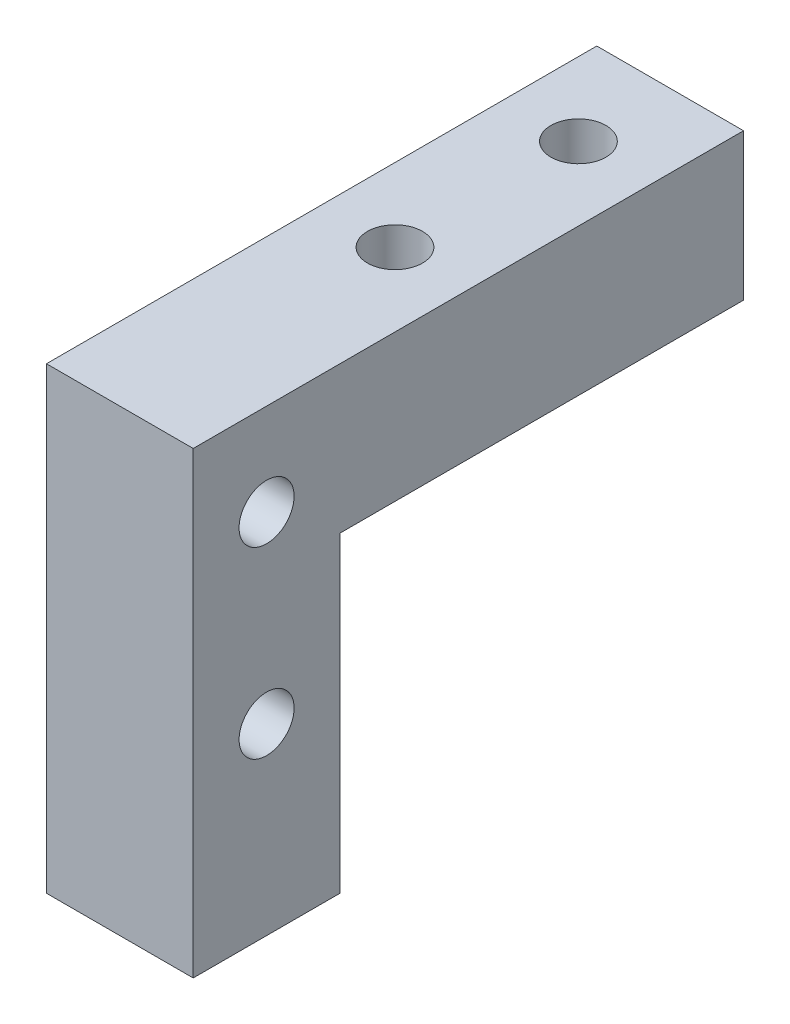
ISO-10303-21;
HEADER;
FILE_DESCRIPTION(('STEP AP214'),'2;1');
FILE_NAME('part.step','',(''),(''),'','','');
FILE_SCHEMA(('AUTOMOTIVE_DESIGN { 1 0 10303 214 1 1 1 1 }'));
ENDSEC;
DATA;
#1=APPLICATION_CONTEXT('core data for automotive mechanical design processes');
#2=APPLICATION_PROTOCOL_DEFINITION('international standard','automotive_design',2000,#1);
#3=PRODUCT_CONTEXT('',#1,'mechanical');
#4=PRODUCT('Part','Part','',(#3));
#5=PRODUCT_RELATED_PRODUCT_CATEGORY('part','',(#4));
#6=PRODUCT_DEFINITION_FORMATION('','',#4);
#7=PRODUCT_DEFINITION_CONTEXT('part definition',#1,'design');
#8=PRODUCT_DEFINITION('design','',#6,#7);
#9=PRODUCT_DEFINITION_SHAPE('','',#8);
#10=(LENGTH_UNIT() NAMED_UNIT(*) SI_UNIT(.MILLI.,.METRE.));
#11=(NAMED_UNIT(*) PLANE_ANGLE_UNIT() SI_UNIT($,.RADIAN.));
#12=(NAMED_UNIT(*) SI_UNIT($,.STERADIAN.) SOLID_ANGLE_UNIT());
#13=UNCERTAINTY_MEASURE_WITH_UNIT(LENGTH_MEASURE(1.E-05),#10,'distance_accuracy_value','');
#14=(GEOMETRIC_REPRESENTATION_CONTEXT(3) GLOBAL_UNCERTAINTY_ASSIGNED_CONTEXT((#13)) GLOBAL_UNIT_ASSIGNED_CONTEXT((#10,
#11,#12)) REPRESENTATION_CONTEXT('',''));
#15=CARTESIAN_POINT('',(0.,0.,0.));
#16=DIRECTION('',(0.,0.,1.));
#17=DIRECTION('',(1.,0.,0.));
#18=AXIS2_PLACEMENT_3D('',#15,#16,#17);
#19=CARTESIAN_POINT('',(8.,0.,-44.));
#20=DIRECTION('',(0.,1.,0.));
#21=DIRECTION('',(0.,0.,1.));
#22=AXIS2_PLACEMENT_3D('',#19,#20,#21);
#23=PLANE('',#22);
#24=CARTESIAN_POINT('',(0.,0.,-14.));
#25=DIRECTION('',(0.,1.,0.));
#26=DIRECTION('',(0.,0.,1.));
#27=AXIS2_PLACEMENT_3D('',#24,#25,#26);
#28=CIRCLE('',#27,3.);
#29=CARTESIAN_POINT('',(0.,0.,-11.));
#30=VERTEX_POINT('',#29);
#31=EDGE_CURVE('E168',#30,#30,#28,.T.);
#32=ORIENTED_EDGE('',*,*,#31,.T.);
#33=EDGE_LOOP('',(#32));
#34=FACE_BOUND('',#33,.T.);
#35=CARTESIAN_POINT('',(0.,0.,-34.));
#36=DIRECTION('',(0.,1.,0.));
#37=DIRECTION('',(0.,0.,1.));
#38=AXIS2_PLACEMENT_3D('',#35,#36,#37);
#39=CIRCLE('',#38,3.);
#40=CARTESIAN_POINT('',(0.,0.,-31.));
#41=VERTEX_POINT('',#40);
#42=EDGE_CURVE('E171',#41,#41,#39,.T.);
#43=ORIENTED_EDGE('',*,*,#42,.T.);
#44=EDGE_LOOP('',(#43));
#45=FACE_BOUND('',#44,.T.);
#46=DIRECTION('',(0.,0.,-1.));
#47=VECTOR('',#46,1.);
#48=CARTESIAN_POINT('',(-8.,0.,-44.));
#49=LINE('',#48,#47);
#50=CARTESIAN_POINT('',(-8.,0.,0.));
#51=VERTEX_POINT('',#50);
#52=CARTESIAN_POINT('',(-8.,0.,-44.));
#53=VERTEX_POINT('',#52);
#54=EDGE_CURVE('E121',#51,#53,#49,.T.);
#55=ORIENTED_EDGE('',*,*,#54,.T.);
#56=DIRECTION('',(-1.,0.,0.));
#57=VECTOR('',#56,1.);
#58=CARTESIAN_POINT('',(8.,0.,-44.));
#59=LINE('',#58,#57);
#60=CARTESIAN_POINT('',(8.,0.,-44.));
#61=VERTEX_POINT('',#60);
#62=EDGE_CURVE('E11',#61,#53,#59,.T.);
#63=ORIENTED_EDGE('',*,*,#62,.F.);
#64=DIRECTION('',(0.,0.,-1.));
#65=VECTOR('',#64,1.);
#66=CARTESIAN_POINT('',(8.,0.,-44.));
#67=LINE('',#66,#65);
#68=CARTESIAN_POINT('',(8.,0.,0.));
#69=VERTEX_POINT('',#68);
#70=EDGE_CURVE('E132',#69,#61,#67,.T.);
#71=ORIENTED_EDGE('',*,*,#70,.F.);
#72=DIRECTION('',(-1.,0.,0.));
#73=VECTOR('',#72,1.);
#74=CARTESIAN_POINT('',(8.,0.,0.));
#75=LINE('',#74,#73);
#76=EDGE_CURVE('E117',#69,#51,#75,.T.);
#77=ORIENTED_EDGE('',*,*,#76,.T.);
#78=EDGE_LOOP('',(#55,#63,#71,#77));
#79=FACE_BOUND('',#78,.T.);
#80=ADVANCED_FACE('F37',(#34,#45,#79),#23,.F.);
#81=CARTESIAN_POINT('',(8.,16.,-44.));
#82=DIRECTION('',(0.,0.,1.));
#83=DIRECTION('',(1.,0.,0.));
#84=AXIS2_PLACEMENT_3D('',#81,#82,#83);
#85=PLANE('',#84);
#86=DIRECTION('',(0.,1.,0.));
#87=VECTOR('',#86,1.);
#88=CARTESIAN_POINT('',(-8.,16.,-44.));
#89=LINE('',#88,#87);
#90=CARTESIAN_POINT('',(-8.,16.,-44.));
#91=VERTEX_POINT('',#90);
#92=EDGE_CURVE('E124',#53,#91,#89,.T.);
#93=ORIENTED_EDGE('',*,*,#92,.T.);
#94=DIRECTION('',(-1.,0.,0.));
#95=VECTOR('',#94,1.);
#96=CARTESIAN_POINT('',(8.,16.,-44.));
#97=LINE('',#96,#95);
#98=CARTESIAN_POINT('',(8.,16.,-44.));
#99=VERTEX_POINT('',#98);
#100=EDGE_CURVE('E45',#99,#91,#97,.T.);
#101=ORIENTED_EDGE('',*,*,#100,.F.);
#102=DIRECTION('',(0.,1.,0.));
#103=VECTOR('',#102,1.);
#104=CARTESIAN_POINT('',(8.,16.,-44.));
#105=LINE('',#104,#103);
#106=EDGE_CURVE('E90',#61,#99,#105,.T.);
#107=ORIENTED_EDGE('',*,*,#106,.F.);
#108=ORIENTED_EDGE('',*,*,#62,.T.);
#109=EDGE_LOOP('',(#93,#101,#107,#108));
#110=FACE_BOUND('',#109,.T.);
#111=ADVANCED_FACE('F158',(#110),#85,.F.);
#112=CARTESIAN_POINT('',(8.,16.,16.));
#113=DIRECTION('',(0.,-1.,0.));
#114=DIRECTION('',(0.,0.,-1.));
#115=AXIS2_PLACEMENT_3D('',#112,#113,#114);
#116=PLANE('',#115);
#117=CARTESIAN_POINT('',(0.,16.,-14.));
#118=DIRECTION('',(0.,1.,0.));
#119=DIRECTION('',(0.,0.,1.));
#120=AXIS2_PLACEMENT_3D('',#117,#118,#119);
#121=CIRCLE('',#120,3.);
#122=CARTESIAN_POINT('',(0.,16.,-11.));
#123=VERTEX_POINT('',#122);
#124=EDGE_CURVE('E221',#123,#123,#121,.T.);
#125=ORIENTED_EDGE('',*,*,#124,.F.);
#126=EDGE_LOOP('',(#125));
#127=FACE_BOUND('',#126,.T.);
#128=CARTESIAN_POINT('',(0.,16.,-34.));
#129=DIRECTION('',(0.,1.,0.));
#130=DIRECTION('',(0.,0.,1.));
#131=AXIS2_PLACEMENT_3D('',#128,#129,#130);
#132=CIRCLE('',#131,3.);
#133=CARTESIAN_POINT('',(0.,16.,-31.));
#134=VERTEX_POINT('',#133);
#135=EDGE_CURVE('E174',#134,#134,#132,.T.);
#136=ORIENTED_EDGE('',*,*,#135,.F.);
#137=EDGE_LOOP('',(#136));
#138=FACE_BOUND('',#137,.T.);
#139=DIRECTION('',(0.,0.,1.));
#140=VECTOR('',#139,1.);
#141=CARTESIAN_POINT('',(-8.,16.,16.));
#142=LINE('',#141,#140);
#143=CARTESIAN_POINT('',(-8.,16.,16.));
#144=VERTEX_POINT('',#143);
#145=EDGE_CURVE('E127',#91,#144,#142,.T.);
#146=ORIENTED_EDGE('',*,*,#145,.T.);
#147=DIRECTION('',(-1.,0.,0.));
#148=VECTOR('',#147,1.);
#149=CARTESIAN_POINT('',(8.,16.,16.));
#150=LINE('',#149,#148);
#151=CARTESIAN_POINT('',(8.,16.,16.));
#152=VERTEX_POINT('',#151);
#153=EDGE_CURVE('E112',#152,#144,#150,.T.);
#154=ORIENTED_EDGE('',*,*,#153,.F.);
#155=DIRECTION('',(0.,0.,1.));
#156=VECTOR('',#155,1.);
#157=CARTESIAN_POINT('',(8.,16.,16.));
#158=LINE('',#157,#156);
#159=EDGE_CURVE('E103',#99,#152,#158,.T.);
#160=ORIENTED_EDGE('',*,*,#159,.F.);
#161=ORIENTED_EDGE('',*,*,#100,.T.);
#162=EDGE_LOOP('',(#146,#154,#160,#161));
#163=FACE_BOUND('',#162,.T.);
#164=ADVANCED_FACE('F138',(#127,#138,#163),#116,.F.);
#165=CARTESIAN_POINT('',(8.,-34.,16.));
#166=DIRECTION('',(0.,0.,-1.));
#167=DIRECTION('',(-1.,0.,0.));
#168=AXIS2_PLACEMENT_3D('',#165,#166,#167);
#169=PLANE('',#168);
#170=DIRECTION('',(0.,-1.,0.));
#171=VECTOR('',#170,1.);
#172=CARTESIAN_POINT('',(-8.,-34.,16.));
#173=LINE('',#172,#171);
#174=CARTESIAN_POINT('',(-8.,-34.,16.));
#175=VERTEX_POINT('',#174);
#176=EDGE_CURVE('E111',#144,#175,#173,.T.);
#177=ORIENTED_EDGE('',*,*,#176,.T.);
#178=DIRECTION('',(-1.,0.,0.));
#179=VECTOR('',#178,1.);
#180=CARTESIAN_POINT('',(8.,-34.,16.));
#181=LINE('',#180,#179);
#182=CARTESIAN_POINT('',(8.,-34.,16.));
#183=VERTEX_POINT('',#182);
#184=EDGE_CURVE('E108',#183,#175,#181,.T.);
#185=ORIENTED_EDGE('',*,*,#184,.F.);
#186=DIRECTION('',(0.,-1.,0.));
#187=VECTOR('',#186,1.);
#188=CARTESIAN_POINT('',(8.,-34.,16.));
#189=LINE('',#188,#187);
#190=EDGE_CURVE('E97',#152,#183,#189,.T.);
#191=ORIENTED_EDGE('',*,*,#190,.F.);
#192=ORIENTED_EDGE('',*,*,#153,.T.);
#193=EDGE_LOOP('',(#177,#185,#191,#192));
#194=FACE_BOUND('',#193,.T.);
#195=ADVANCED_FACE('F109',(#194),#169,.F.);
#196=CARTESIAN_POINT('',(8.,-34.,0.));
#197=DIRECTION('',(0.,1.,0.));
#198=DIRECTION('',(0.,0.,1.));
#199=AXIS2_PLACEMENT_3D('',#196,#197,#198);
#200=PLANE('',#199);
#201=DIRECTION('',(0.,0.,-1.));
#202=VECTOR('',#201,1.);
#203=CARTESIAN_POINT('',(-8.,-34.,0.));
#204=LINE('',#203,#202);
#205=CARTESIAN_POINT('',(-8.,-34.,0.));
#206=VERTEX_POINT('',#205);
#207=EDGE_CURVE('E76',#175,#206,#204,.T.);
#208=ORIENTED_EDGE('',*,*,#207,.T.);
#209=DIRECTION('',(-1.,0.,0.));
#210=VECTOR('',#209,1.);
#211=CARTESIAN_POINT('',(8.,-34.,0.));
#212=LINE('',#211,#210);
#213=CARTESIAN_POINT('',(8.,-34.,0.));
#214=VERTEX_POINT('',#213);
#215=EDGE_CURVE('E113',#214,#206,#212,.T.);
#216=ORIENTED_EDGE('',*,*,#215,.F.);
#217=DIRECTION('',(0.,0.,-1.));
#218=VECTOR('',#217,1.);
#219=CARTESIAN_POINT('',(8.,-34.,0.));
#220=LINE('',#219,#218);
#221=EDGE_CURVE('E101',#183,#214,#220,.T.);
#222=ORIENTED_EDGE('',*,*,#221,.F.);
#223=ORIENTED_EDGE('',*,*,#184,.T.);
#224=EDGE_LOOP('',(#208,#216,#222,#223));
#225=FACE_BOUND('',#224,.T.);
#226=ADVANCED_FACE('F115',(#225),#200,.F.);
#227=CARTESIAN_POINT('',(8.,0.,0.));
#228=DIRECTION('',(0.,0.,1.));
#229=DIRECTION('',(0.,-1.,0.));
#230=AXIS2_PLACEMENT_3D('',#227,#228,#229);
#231=PLANE('',#230);
#232=DIRECTION('',(0.,1.,0.));
#233=VECTOR('',#232,1.);
#234=CARTESIAN_POINT('',(-8.,0.,0.));
#235=LINE('',#234,#233);
#236=EDGE_CURVE('E82',#206,#51,#235,.T.);
#237=ORIENTED_EDGE('',*,*,#236,.T.);
#238=ORIENTED_EDGE('',*,*,#76,.F.);
#239=DIRECTION('',(0.,1.,0.));
#240=VECTOR('',#239,1.);
#241=CARTESIAN_POINT('',(8.,0.,0.));
#242=LINE('',#241,#240);
#243=EDGE_CURVE('E53',#214,#69,#242,.T.);
#244=ORIENTED_EDGE('',*,*,#243,.F.);
#245=ORIENTED_EDGE('',*,*,#215,.T.);
#246=EDGE_LOOP('',(#237,#238,#244,#245));
#247=FACE_BOUND('',#246,.T.);
#248=ADVANCED_FACE('F145',(#247),#231,.F.);
#249=CARTESIAN_POINT('',(8.,0.,0.));
#250=DIRECTION('',(1.,0.,0.));
#251=DIRECTION('',(0.,0.,-1.));
#252=AXIS2_PLACEMENT_3D('',#249,#250,#251);
#253=PLANE('',#252);
#254=CARTESIAN_POINT('',(8.,-14.,8.));
#255=DIRECTION('',(1.,0.,0.));
#256=DIRECTION('',(0.,0.,-1.));
#257=AXIS2_PLACEMENT_3D('',#254,#255,#256);
#258=CIRCLE('',#257,3.);
#259=CARTESIAN_POINT('',(8.,-14.,5.));
#260=VERTEX_POINT('',#259);
#261=EDGE_CURVE('E173',#260,#260,#258,.T.);
#262=ORIENTED_EDGE('',*,*,#261,.F.);
#263=EDGE_LOOP('',(#262));
#264=FACE_BOUND('',#263,.T.);
#265=CARTESIAN_POINT('',(8.,6.00000000000001,7.99999999999999));
#266=DIRECTION('',(1.,0.,0.));
#267=DIRECTION('',(0.,0.,-1.));
#268=AXIS2_PLACEMENT_3D('',#265,#266,#267);
#269=CIRCLE('',#268,3.);
#270=CARTESIAN_POINT('',(8.,6.00000000000001,4.99999999999999));
#271=VERTEX_POINT('',#270);
#272=EDGE_CURVE('E184',#271,#271,#269,.T.);
#273=ORIENTED_EDGE('',*,*,#272,.F.);
#274=EDGE_LOOP('',(#273));
#275=FACE_BOUND('',#274,.T.);
#276=ORIENTED_EDGE('',*,*,#70,.T.);
#277=ORIENTED_EDGE('',*,*,#106,.T.);
#278=ORIENTED_EDGE('',*,*,#159,.T.);
#279=ORIENTED_EDGE('',*,*,#190,.T.);
#280=ORIENTED_EDGE('',*,*,#221,.T.);
#281=ORIENTED_EDGE('',*,*,#243,.T.);
#282=EDGE_LOOP('',(#276,#277,#278,#279,#280,#281));
#283=FACE_BOUND('',#282,.T.);
#284=ADVANCED_FACE('F99',(#264,#275,#283),#253,.T.);
#285=CARTESIAN_POINT('',(-8.,0.,0.));
#286=DIRECTION('',(1.,0.,0.));
#287=DIRECTION('',(0.,0.,-1.));
#288=AXIS2_PLACEMENT_3D('',#285,#286,#287);
#289=PLANE('',#288);
#290=CARTESIAN_POINT('',(-8.,-14.,8.));
#291=DIRECTION('',(1.,0.,0.));
#292=DIRECTION('',(0.,0.,-1.));
#293=AXIS2_PLACEMENT_3D('',#290,#291,#292);
#294=CIRCLE('',#293,3.);
#295=CARTESIAN_POINT('',(-8.,-14.,5.));
#296=VERTEX_POINT('',#295);
#297=EDGE_CURVE('E177',#296,#296,#294,.T.);
#298=ORIENTED_EDGE('',*,*,#297,.T.);
#299=EDGE_LOOP('',(#298));
#300=FACE_BOUND('',#299,.T.);
#301=CARTESIAN_POINT('',(-8.,6.00000000000001,7.99999999999999));
#302=DIRECTION('',(1.,0.,0.));
#303=DIRECTION('',(0.,0.,-1.));
#304=AXIS2_PLACEMENT_3D('',#301,#302,#303);
#305=CIRCLE('',#304,3.);
#306=CARTESIAN_POINT('',(-8.,6.00000000000001,4.99999999999999));
#307=VERTEX_POINT('',#306);
#308=EDGE_CURVE('E125',#307,#307,#305,.T.);
#309=ORIENTED_EDGE('',*,*,#308,.T.);
#310=EDGE_LOOP('',(#309));
#311=FACE_BOUND('',#310,.T.);
#312=ORIENTED_EDGE('',*,*,#54,.F.);
#313=ORIENTED_EDGE('',*,*,#236,.F.);
#314=ORIENTED_EDGE('',*,*,#207,.F.);
#315=ORIENTED_EDGE('',*,*,#176,.F.);
#316=ORIENTED_EDGE('',*,*,#145,.F.);
#317=ORIENTED_EDGE('',*,*,#92,.F.);
#318=EDGE_LOOP('',(#312,#313,#314,#315,#316,#317));
#319=FACE_BOUND('',#318,.T.);
#320=ADVANCED_FACE('F141',(#300,#311,#319),#289,.F.);
#321=CARTESIAN_POINT('',(-8.,6.00000000000001,7.99999999999999));
#322=DIRECTION('',(1.,0.,0.));
#323=DIRECTION('',(0.,0.,-1.));
#324=AXIS2_PLACEMENT_3D('',#321,#322,#323);
#325=CYLINDRICAL_SURFACE('',#324,3.);
#326=ORIENTED_EDGE('',*,*,#308,.F.);
#327=EDGE_LOOP('',(#326));
#328=FACE_BOUND('',#327,.T.);
#329=ORIENTED_EDGE('',*,*,#272,.T.);
#330=EDGE_LOOP('',(#329));
#331=FACE_BOUND('',#330,.T.);
#332=ADVANCED_FACE('F193',(#328,#331),#325,.F.);
#333=CARTESIAN_POINT('',(-8.,-14.,8.));
#334=DIRECTION('',(1.,0.,0.));
#335=DIRECTION('',(0.,0.,-1.));
#336=AXIS2_PLACEMENT_3D('',#333,#334,#335);
#337=CYLINDRICAL_SURFACE('',#336,3.);
#338=ORIENTED_EDGE('',*,*,#297,.F.);
#339=EDGE_LOOP('',(#338));
#340=FACE_BOUND('',#339,.T.);
#341=ORIENTED_EDGE('',*,*,#261,.T.);
#342=EDGE_LOOP('',(#341));
#343=FACE_BOUND('',#342,.T.);
#344=ADVANCED_FACE('F196',(#340,#343),#337,.F.);
#345=CARTESIAN_POINT('',(0.,-34.,-34.));
#346=DIRECTION('',(0.,1.,0.));
#347=DIRECTION('',(0.,0.,1.));
#348=AXIS2_PLACEMENT_3D('',#345,#346,#347);
#349=CYLINDRICAL_SURFACE('',#348,3.);
#350=ORIENTED_EDGE('',*,*,#135,.T.);
#351=EDGE_LOOP('',(#350));
#352=FACE_BOUND('',#351,.T.);
#353=ORIENTED_EDGE('',*,*,#42,.F.);
#354=EDGE_LOOP('',(#353));
#355=FACE_BOUND('',#354,.T.);
#356=ADVANCED_FACE('F203',(#352,#355),#349,.F.);
#357=CARTESIAN_POINT('',(0.,-34.,-14.));
#358=DIRECTION('',(0.,1.,0.));
#359=DIRECTION('',(0.,0.,1.));
#360=AXIS2_PLACEMENT_3D('',#357,#358,#359);
#361=CYLINDRICAL_SURFACE('',#360,3.);
#362=ORIENTED_EDGE('',*,*,#124,.T.);
#363=EDGE_LOOP('',(#362));
#364=FACE_BOUND('',#363,.T.);
#365=ORIENTED_EDGE('',*,*,#31,.F.);
#366=EDGE_LOOP('',(#365));
#367=FACE_BOUND('',#366,.T.);
#368=ADVANCED_FACE('F212',(#364,#367),#361,.F.);
#369=CLOSED_SHELL('',(#80,#111,#164,#195,#226,#248,#284,#320,#332,#344,#356,#368));
#370=MANIFOLD_SOLID_BREP('B2',#369);
#371=ADVANCED_BREP_SHAPE_REPRESENTATION('',(#18,#370),#14);
#372=SHAPE_DEFINITION_REPRESENTATION(#9,#371);
ENDSEC;
END-ISO-10303-21;
